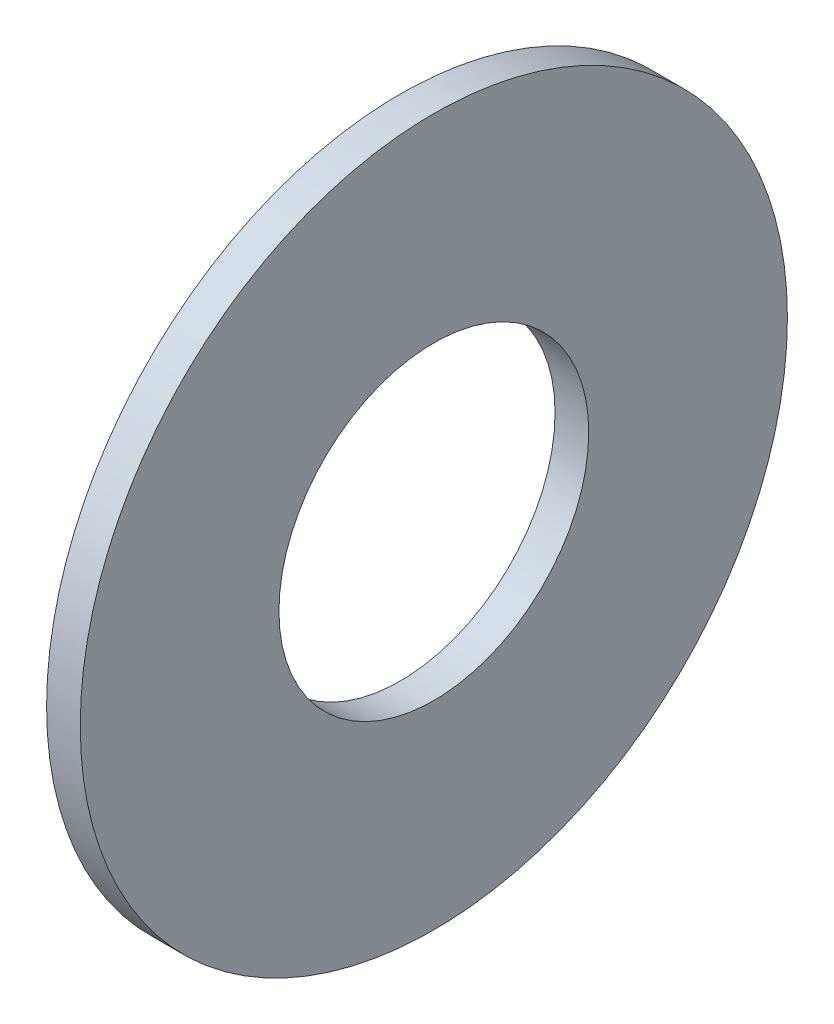
ISO-10303-21;
HEADER;
FILE_DESCRIPTION(('STEP AP214'),'2;1');
FILE_NAME('part.step','',(''),(''),'','','');
FILE_SCHEMA(('AUTOMOTIVE_DESIGN { 1 0 10303 214 1 1 1 1 }'));
ENDSEC;
DATA;
#1=APPLICATION_CONTEXT('core data for automotive mechanical design processes');
#2=APPLICATION_PROTOCOL_DEFINITION('international standard','automotive_design',2000,#1);
#3=PRODUCT_CONTEXT('',#1,'mechanical');
#4=PRODUCT('Part','Part','',(#3));
#5=PRODUCT_RELATED_PRODUCT_CATEGORY('part','',(#4));
#6=PRODUCT_DEFINITION_FORMATION('','',#4);
#7=PRODUCT_DEFINITION_CONTEXT('part definition',#1,'design');
#8=PRODUCT_DEFINITION('design','',#6,#7);
#9=PRODUCT_DEFINITION_SHAPE('','',#8);
#10=(LENGTH_UNIT() NAMED_UNIT(*) SI_UNIT(.MILLI.,.METRE.));
#11=(NAMED_UNIT(*) PLANE_ANGLE_UNIT() SI_UNIT($,.RADIAN.));
#12=(NAMED_UNIT(*) SI_UNIT($,.STERADIAN.) SOLID_ANGLE_UNIT());
#13=UNCERTAINTY_MEASURE_WITH_UNIT(LENGTH_MEASURE(1.E-05),#10,'distance_accuracy_value','');
#14=(GEOMETRIC_REPRESENTATION_CONTEXT(3) GLOBAL_UNCERTAINTY_ASSIGNED_CONTEXT((#13)) GLOBAL_UNIT_ASSIGNED_CONTEXT((#10,
#11,#12)) REPRESENTATION_CONTEXT('',''));
#15=CARTESIAN_POINT('',(0.,0.,0.));
#16=DIRECTION('',(0.,0.,1.));
#17=DIRECTION('',(1.,0.,0.));
#18=AXIS2_PLACEMENT_3D('',#15,#16,#17);
#19=CARTESIAN_POINT('',(1.,0.,0.));
#20=DIRECTION('',(1.,0.,0.));
#21=DIRECTION('',(0.,0.,-1.));
#22=AXIS2_PLACEMENT_3D('',#19,#20,#21);
#23=PLANE('',#22);
#24=CARTESIAN_POINT('',(1.,0.,0.));
#25=DIRECTION('',(1.,0.,0.));
#26=DIRECTION('',(0.,0.,-1.));
#27=AXIS2_PLACEMENT_3D('',#24,#25,#26);
#28=CIRCLE('',#27,10.5);
#29=CARTESIAN_POINT('',(1.,0.,-10.5));
#30=VERTEX_POINT('',#29);
#31=EDGE_CURVE('E10',#30,#30,#28,.T.);
#32=ORIENTED_EDGE('',*,*,#31,.T.);
#33=EDGE_LOOP('',(#32));
#34=FACE_BOUND('',#33,.T.);
#35=CARTESIAN_POINT('',(1.,0.,0.));
#36=DIRECTION('',(1.,0.,0.));
#37=DIRECTION('',(0.,0.,-1.));
#38=AXIS2_PLACEMENT_3D('',#35,#36,#37);
#39=CIRCLE('',#38,4.6);
#40=CARTESIAN_POINT('',(1.,0.,-4.6));
#41=VERTEX_POINT('',#40);
#42=EDGE_CURVE('E41',#41,#41,#39,.T.);
#43=ORIENTED_EDGE('',*,*,#42,.F.);
#44=EDGE_LOOP('',(#43));
#45=FACE_BOUND('',#44,.T.);
#46=ADVANCED_FACE('F30',(#34,#45),#23,.T.);
#47=CARTESIAN_POINT('',(0.,0.,0.));
#48=DIRECTION('',(1.,0.,0.));
#49=DIRECTION('',(0.,0.,-1.));
#50=AXIS2_PLACEMENT_3D('',#47,#48,#49);
#51=PLANE('',#50);
#52=CARTESIAN_POINT('',(0.,0.,0.));
#53=DIRECTION('',(1.,0.,0.));
#54=DIRECTION('',(0.,0.,-1.));
#55=AXIS2_PLACEMENT_3D('',#52,#53,#54);
#56=CIRCLE('',#55,10.5);
#57=CARTESIAN_POINT('',(0.,0.,-10.5));
#58=VERTEX_POINT('',#57);
#59=EDGE_CURVE('E34',#58,#58,#56,.T.);
#60=ORIENTED_EDGE('',*,*,#59,.F.);
#61=EDGE_LOOP('',(#60));
#62=FACE_BOUND('',#61,.T.);
#63=CARTESIAN_POINT('',(0.,0.,0.));
#64=DIRECTION('',(1.,0.,0.));
#65=DIRECTION('',(0.,0.,-1.));
#66=AXIS2_PLACEMENT_3D('',#63,#64,#65);
#67=CIRCLE('',#66,4.6);
#68=CARTESIAN_POINT('',(0.,0.,-4.6));
#69=VERTEX_POINT('',#68);
#70=EDGE_CURVE('E43',#69,#69,#67,.T.);
#71=ORIENTED_EDGE('',*,*,#70,.T.);
#72=EDGE_LOOP('',(#71));
#73=FACE_BOUND('',#72,.T.);
#74=ADVANCED_FACE('F53',(#62,#73),#51,.F.);
#75=CARTESIAN_POINT('',(1.,0.,0.));
#76=DIRECTION('',(-1.,0.,0.));
#77=DIRECTION('',(0.,0.,1.));
#78=AXIS2_PLACEMENT_3D('',#75,#76,#77);
#79=CYLINDRICAL_SURFACE('',#78,10.5);
#80=ORIENTED_EDGE('',*,*,#31,.F.);
#81=EDGE_LOOP('',(#80));
#82=FACE_BOUND('',#81,.T.);
#83=ORIENTED_EDGE('',*,*,#59,.T.);
#84=EDGE_LOOP('',(#83));
#85=FACE_BOUND('',#84,.T.);
#86=ADVANCED_FACE('F32',(#82,#85),#79,.T.);
#87=CARTESIAN_POINT('',(1.,0.,0.));
#88=DIRECTION('',(-1.,0.,0.));
#89=DIRECTION('',(0.,0.,1.));
#90=AXIS2_PLACEMENT_3D('',#87,#88,#89);
#91=CYLINDRICAL_SURFACE('',#90,4.6);
#92=ORIENTED_EDGE('',*,*,#42,.T.);
#93=EDGE_LOOP('',(#92));
#94=FACE_BOUND('',#93,.T.);
#95=ORIENTED_EDGE('',*,*,#70,.F.);
#96=EDGE_LOOP('',(#95));
#97=FACE_BOUND('',#96,.T.);
#98=ADVANCED_FACE('F49',(#94,#97),#91,.F.);
#99=CLOSED_SHELL('',(#46,#74,#86,#98));
#100=MANIFOLD_SOLID_BREP('B2',#99);
#101=ADVANCED_BREP_SHAPE_REPRESENTATION('',(#18,#100),#14);
#102=SHAPE_DEFINITION_REPRESENTATION(#9,#101);
ENDSEC;
END-ISO-10303-21;
